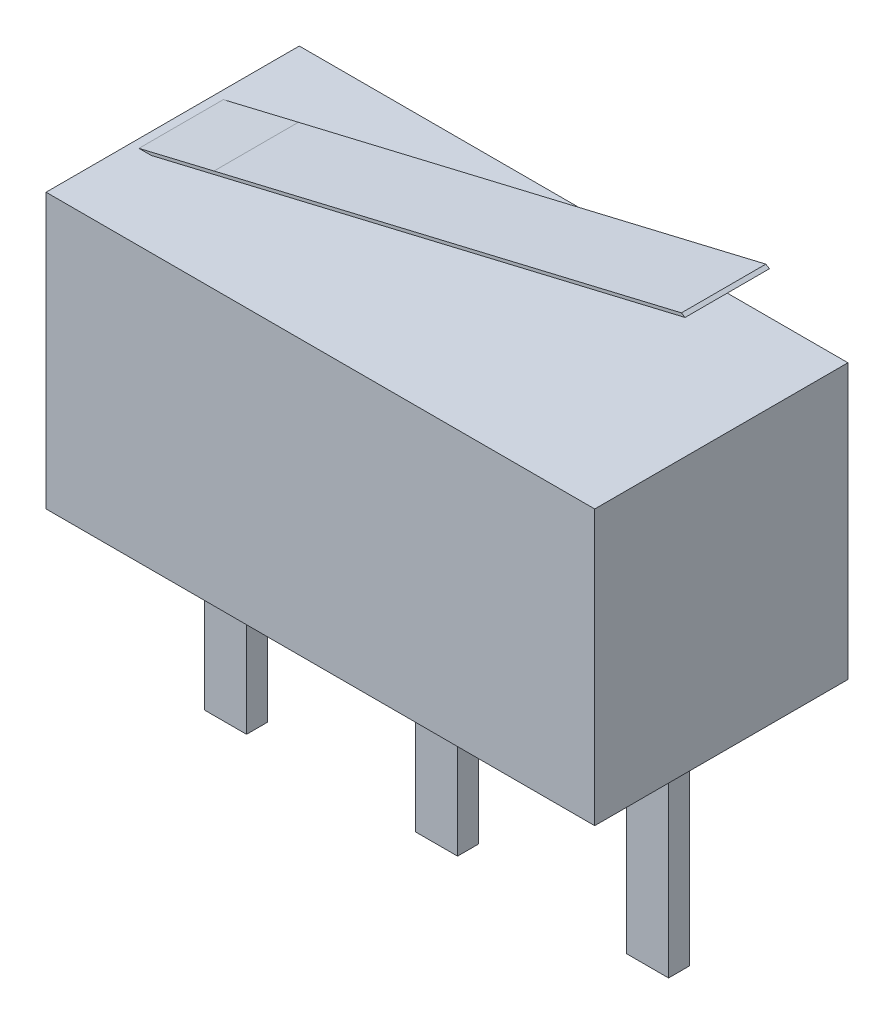
ISO-10303-21;
HEADER;
FILE_DESCRIPTION(('STEP AP214'),'2;1');
FILE_NAME('part.step','',(''),(''),'','','');
FILE_SCHEMA(('AUTOMOTIVE_DESIGN { 1 0 10303 214 1 1 1 1 }'));
ENDSEC;
DATA;
#1=APPLICATION_CONTEXT('core data for automotive mechanical design processes');
#2=APPLICATION_PROTOCOL_DEFINITION('international standard','automotive_design',2000,#1);
#3=PRODUCT_CONTEXT('',#1,'mechanical');
#4=PRODUCT('Part','Part','',(#3));
#5=PRODUCT_RELATED_PRODUCT_CATEGORY('part','',(#4));
#6=PRODUCT_DEFINITION_FORMATION('','',#4);
#7=PRODUCT_DEFINITION_CONTEXT('part definition',#1,'design');
#8=PRODUCT_DEFINITION('design','',#6,#7);
#9=PRODUCT_DEFINITION_SHAPE('','',#8);
#10=(LENGTH_UNIT() NAMED_UNIT(*) SI_UNIT(.MILLI.,.METRE.));
#11=(NAMED_UNIT(*) PLANE_ANGLE_UNIT() SI_UNIT($,.RADIAN.));
#12=(NAMED_UNIT(*) SI_UNIT($,.STERADIAN.) SOLID_ANGLE_UNIT());
#13=UNCERTAINTY_MEASURE_WITH_UNIT(LENGTH_MEASURE(1.E-05),#10,'distance_accuracy_value','');
#14=(GEOMETRIC_REPRESENTATION_CONTEXT(3) GLOBAL_UNCERTAINTY_ASSIGNED_CONTEXT((#13)) GLOBAL_UNIT_ASSIGNED_CONTEXT((#10,
#11,#12)) REPRESENTATION_CONTEXT('',''));
#15=CARTESIAN_POINT('',(0.,0.,0.));
#16=DIRECTION('',(0.,0.,1.));
#17=DIRECTION('',(1.,0.,0.));
#18=AXIS2_PLACEMENT_3D('',#15,#16,#17);
#19=CARTESIAN_POINT('',(0.,0.,0.));
#20=DIRECTION('',(0.,-1.,0.));
#21=DIRECTION('',(0.,0.,-1.));
#22=AXIS2_PLACEMENT_3D('',#19,#20,#21);
#23=PLANE('',#22);
#24=DIRECTION('',(0.,0.,-1.));
#25=VECTOR('',#24,1.);
#26=CARTESIAN_POINT('',(6.5,0.,3.));
#27=LINE('',#26,#25);
#28=CARTESIAN_POINT('',(6.5,0.,3.));
#29=VERTEX_POINT('',#28);
#30=CARTESIAN_POINT('',(6.5,0.,-3.));
#31=VERTEX_POINT('',#30);
#32=EDGE_CURVE('E308',#29,#31,#27,.T.);
#33=ORIENTED_EDGE('',*,*,#32,.F.);
#34=DIRECTION('',(1.,0.,0.));
#35=VECTOR('',#34,1.);
#36=CARTESIAN_POINT('',(-6.5,0.,3.));
#37=LINE('',#36,#35);
#38=CARTESIAN_POINT('',(-6.5,0.,3.));
#39=VERTEX_POINT('',#38);
#40=EDGE_CURVE('E313',#39,#29,#37,.T.);
#41=ORIENTED_EDGE('',*,*,#40,.F.);
#42=DIRECTION('',(0.,0.,1.));
#43=VECTOR('',#42,1.);
#44=CARTESIAN_POINT('',(-6.5,0.,3.));
#45=LINE('',#44,#43);
#46=CARTESIAN_POINT('',(-6.5,0.,-3.));
#47=VERTEX_POINT('',#46);
#48=EDGE_CURVE('E324',#47,#39,#45,.T.);
#49=ORIENTED_EDGE('',*,*,#48,.F.);
#50=DIRECTION('',(-1.,0.,0.));
#51=VECTOR('',#50,1.);
#52=CARTESIAN_POINT('',(-6.5,0.,-3.));
#53=LINE('',#52,#51);
#54=EDGE_CURVE('E322',#31,#47,#53,.T.);
#55=ORIENTED_EDGE('',*,*,#54,.F.);
#56=EDGE_LOOP('',(#33,#41,#49,#55));
#57=FACE_BOUND('',#56,.T.);
#58=DIRECTION('',(1.,0.,0.));
#59=VECTOR('',#58,1.);
#60=CARTESIAN_POINT('',(-4.5,0.,-0.25));
#61=LINE('',#60,#59);
#62=CARTESIAN_POINT('',(-5.5,0.,-0.25));
#63=VERTEX_POINT('',#62);
#64=CARTESIAN_POINT('',(-4.5,0.,-0.25));
#65=VERTEX_POINT('',#64);
#66=EDGE_CURVE('E293',#63,#65,#61,.T.);
#67=ORIENTED_EDGE('',*,*,#66,.F.);
#68=DIRECTION('',(0.,0.,-1.));
#69=VECTOR('',#68,1.);
#70=CARTESIAN_POINT('',(-5.5,0.,-0.25));
#71=LINE('',#70,#69);
#72=CARTESIAN_POINT('',(-5.5,0.,0.25));
#73=VERTEX_POINT('',#72);
#74=EDGE_CURVE('E272',#73,#63,#71,.T.);
#75=ORIENTED_EDGE('',*,*,#74,.F.);
#76=DIRECTION('',(-1.,0.,0.));
#77=VECTOR('',#76,1.);
#78=CARTESIAN_POINT('',(-4.5,0.,0.25));
#79=LINE('',#78,#77);
#80=CARTESIAN_POINT('',(-4.5,0.,0.25));
#81=VERTEX_POINT('',#80);
#82=EDGE_CURVE('E284',#81,#73,#79,.T.);
#83=ORIENTED_EDGE('',*,*,#82,.F.);
#84=DIRECTION('',(0.,0.,1.));
#85=VECTOR('',#84,1.);
#86=CARTESIAN_POINT('',(-4.5,0.,-0.25));
#87=LINE('',#86,#85);
#88=EDGE_CURVE('E295',#65,#81,#87,.T.);
#89=ORIENTED_EDGE('',*,*,#88,.F.);
#90=EDGE_LOOP('',(#67,#75,#83,#89));
#91=FACE_BOUND('',#90,.T.);
#92=DIRECTION('',(1.,0.,0.));
#93=VECTOR('',#92,1.);
#94=CARTESIAN_POINT('',(0.5,0.,-0.250000000000001));
#95=LINE('',#94,#93);
#96=CARTESIAN_POINT('',(-0.5,0.,-0.250000000000001));
#97=VERTEX_POINT('',#96);
#98=CARTESIAN_POINT('',(0.5,0.,-0.250000000000001));
#99=VERTEX_POINT('',#98);
#100=EDGE_CURVE('E267',#97,#99,#95,.T.);
#101=ORIENTED_EDGE('',*,*,#100,.F.);
#102=DIRECTION('',(0.,0.,-1.));
#103=VECTOR('',#102,1.);
#104=CARTESIAN_POINT('',(-0.5,0.,-0.250000000000001));
#105=LINE('',#104,#103);
#106=CARTESIAN_POINT('',(-0.5,0.,0.25));
#107=VERTEX_POINT('',#106);
#108=EDGE_CURVE('E269',#107,#97,#105,.T.);
#109=ORIENTED_EDGE('',*,*,#108,.F.);
#110=DIRECTION('',(-1.,0.,0.));
#111=VECTOR('',#110,1.);
#112=CARTESIAN_POINT('',(0.5,0.,0.25));
#113=LINE('',#112,#111);
#114=CARTESIAN_POINT('',(0.5,0.,0.25));
#115=VERTEX_POINT('',#114);
#116=EDGE_CURVE('E261',#115,#107,#113,.T.);
#117=ORIENTED_EDGE('',*,*,#116,.F.);
#118=DIRECTION('',(0.,0.,1.));
#119=VECTOR('',#118,1.);
#120=CARTESIAN_POINT('',(0.5,0.,-0.250000000000001));
#121=LINE('',#120,#119);
#122=EDGE_CURVE('E263',#99,#115,#121,.T.);
#123=ORIENTED_EDGE('',*,*,#122,.F.);
#124=EDGE_LOOP('',(#101,#109,#117,#123));
#125=FACE_BOUND('',#124,.T.);
#126=DIRECTION('',(1.,0.,0.));
#127=VECTOR('',#126,1.);
#128=CARTESIAN_POINT('',(5.5,0.,-0.25));
#129=LINE('',#128,#127);
#130=CARTESIAN_POINT('',(4.5,0.,-0.25));
#131=VERTEX_POINT('',#130);
#132=CARTESIAN_POINT('',(5.5,0.,-0.25));
#133=VERTEX_POINT('',#132);
#134=EDGE_CURVE('E238',#131,#133,#129,.T.);
#135=ORIENTED_EDGE('',*,*,#134,.F.);
#136=DIRECTION('',(0.,0.,-1.));
#137=VECTOR('',#136,1.);
#138=CARTESIAN_POINT('',(4.5,0.,-0.25));
#139=LINE('',#138,#137);
#140=CARTESIAN_POINT('',(4.5,0.,0.25));
#141=VERTEX_POINT('',#140);
#142=EDGE_CURVE('E240',#141,#131,#139,.T.);
#143=ORIENTED_EDGE('',*,*,#142,.F.);
#144=DIRECTION('',(-1.,0.,0.));
#145=VECTOR('',#144,1.);
#146=CARTESIAN_POINT('',(5.5,0.,0.25));
#147=LINE('',#146,#145);
#148=CARTESIAN_POINT('',(5.5,0.,0.25));
#149=VERTEX_POINT('',#148);
#150=EDGE_CURVE('E232',#149,#141,#147,.T.);
#151=ORIENTED_EDGE('',*,*,#150,.F.);
#152=DIRECTION('',(0.,0.,1.));
#153=VECTOR('',#152,1.);
#154=CARTESIAN_POINT('',(5.5,0.,-0.25));
#155=LINE('',#154,#153);
#156=EDGE_CURVE('E234',#133,#149,#155,.T.);
#157=ORIENTED_EDGE('',*,*,#156,.F.);
#158=EDGE_LOOP('',(#135,#143,#151,#157));
#159=FACE_BOUND('',#158,.T.);
#160=ADVANCED_FACE('F37',(#57,#91,#125,#159),#23,.T.);
#161=CARTESIAN_POINT('',(6.5,6.5,3.));
#162=DIRECTION('',(-1.,0.,0.));
#163=DIRECTION('',(0.,0.,1.));
#164=AXIS2_PLACEMENT_3D('',#161,#162,#163);
#165=PLANE('',#164);
#166=ORIENTED_EDGE('',*,*,#32,.T.);
#167=DIRECTION('',(0.,-1.,0.));
#168=VECTOR('',#167,1.);
#169=CARTESIAN_POINT('',(6.5,6.5,-3.));
#170=LINE('',#169,#168);
#171=CARTESIAN_POINT('',(6.5,6.5,-3.));
#172=VERTEX_POINT('',#171);
#173=EDGE_CURVE('E11',#172,#31,#170,.T.);
#174=ORIENTED_EDGE('',*,*,#173,.F.);
#175=DIRECTION('',(0.,0.,-1.));
#176=VECTOR('',#175,1.);
#177=CARTESIAN_POINT('',(6.5,6.5,3.));
#178=LINE('',#177,#176);
#179=CARTESIAN_POINT('',(6.5,6.5,3.));
#180=VERTEX_POINT('',#179);
#181=EDGE_CURVE('E309',#180,#172,#178,.T.);
#182=ORIENTED_EDGE('',*,*,#181,.F.);
#183=DIRECTION('',(0.,-1.,0.));
#184=VECTOR('',#183,1.);
#185=CARTESIAN_POINT('',(6.5,6.5,3.));
#186=LINE('',#185,#184);
#187=EDGE_CURVE('E319',#180,#29,#186,.T.);
#188=ORIENTED_EDGE('',*,*,#187,.T.);
#189=EDGE_LOOP('',(#166,#174,#182,#188));
#190=FACE_BOUND('',#189,.T.);
#191=ADVANCED_FACE('F39',(#190),#165,.F.);
#192=CARTESIAN_POINT('',(-6.5,6.5,-3.));
#193=DIRECTION('',(0.,0.,1.));
#194=DIRECTION('',(1.,0.,0.));
#195=AXIS2_PLACEMENT_3D('',#192,#193,#194);
#196=PLANE('',#195);
#197=ORIENTED_EDGE('',*,*,#54,.T.);
#198=DIRECTION('',(0.,-1.,0.));
#199=VECTOR('',#198,1.);
#200=CARTESIAN_POINT('',(-6.5,6.5,-3.));
#201=LINE('',#200,#199);
#202=CARTESIAN_POINT('',(-6.5,6.5,-3.));
#203=VERTEX_POINT('',#202);
#204=EDGE_CURVE('E45',#203,#47,#201,.T.);
#205=ORIENTED_EDGE('',*,*,#204,.F.);
#206=DIRECTION('',(-1.,0.,0.));
#207=VECTOR('',#206,1.);
#208=CARTESIAN_POINT('',(-6.5,6.5,-3.));
#209=LINE('',#208,#207);
#210=EDGE_CURVE('E312',#172,#203,#209,.T.);
#211=ORIENTED_EDGE('',*,*,#210,.F.);
#212=ORIENTED_EDGE('',*,*,#173,.T.);
#213=EDGE_LOOP('',(#197,#205,#211,#212));
#214=FACE_BOUND('',#213,.T.);
#215=ADVANCED_FACE('F352',(#214),#196,.F.);
#216=CARTESIAN_POINT('',(-6.5,6.5,3.));
#217=DIRECTION('',(1.,0.,0.));
#218=DIRECTION('',(0.,0.,-1.));
#219=AXIS2_PLACEMENT_3D('',#216,#217,#218);
#220=PLANE('',#219);
#221=ORIENTED_EDGE('',*,*,#48,.T.);
#222=DIRECTION('',(0.,-1.,0.));
#223=VECTOR('',#222,1.);
#224=CARTESIAN_POINT('',(-6.5,6.5,3.));
#225=LINE('',#224,#223);
#226=CARTESIAN_POINT('',(-6.5,6.5,3.));
#227=VERTEX_POINT('',#226);
#228=EDGE_CURVE('E329',#227,#39,#225,.T.);
#229=ORIENTED_EDGE('',*,*,#228,.F.);
#230=DIRECTION('',(0.,0.,1.));
#231=VECTOR('',#230,1.);
#232=CARTESIAN_POINT('',(-6.5,6.5,3.));
#233=LINE('',#232,#231);
#234=EDGE_CURVE('E315',#203,#227,#233,.T.);
#235=ORIENTED_EDGE('',*,*,#234,.F.);
#236=ORIENTED_EDGE('',*,*,#204,.T.);
#237=EDGE_LOOP('',(#221,#229,#235,#236));
#238=FACE_BOUND('',#237,.T.);
#239=ADVANCED_FACE('F336',(#238),#220,.F.);
#240=CARTESIAN_POINT('',(-6.5,6.5,3.));
#241=DIRECTION('',(0.,0.,-1.));
#242=DIRECTION('',(-1.,0.,0.));
#243=AXIS2_PLACEMENT_3D('',#240,#241,#242);
#244=PLANE('',#243);
#245=ORIENTED_EDGE('',*,*,#40,.T.);
#246=ORIENTED_EDGE('',*,*,#187,.F.);
#247=DIRECTION('',(1.,0.,0.));
#248=VECTOR('',#247,1.);
#249=CARTESIAN_POINT('',(-6.5,6.5,3.));
#250=LINE('',#249,#248);
#251=EDGE_CURVE('E317',#227,#180,#250,.T.);
#252=ORIENTED_EDGE('',*,*,#251,.F.);
#253=ORIENTED_EDGE('',*,*,#228,.T.);
#254=EDGE_LOOP('',(#245,#246,#252,#253));
#255=FACE_BOUND('',#254,.T.);
#256=ADVANCED_FACE('F345',(#255),#244,.F.);
#257=CARTESIAN_POINT('',(0.,6.5,0.));
#258=DIRECTION('',(0.,-1.,0.));
#259=DIRECTION('',(0.,0.,-1.));
#260=AXIS2_PLACEMENT_3D('',#257,#258,#259);
#261=PLANE('',#260);
#262=DIRECTION('',(0.,0.,-1.));
#263=VECTOR('',#262,1.);
#264=CARTESIAN_POINT('',(-6.00813504961085,6.5,1.));
#265=LINE('',#264,#263);
#266=CARTESIAN_POINT('',(-6.00813504961085,6.5,1.));
#267=VERTEX_POINT('',#266);
#268=CARTESIAN_POINT('',(-6.00813504961085,6.5,-1.));
#269=VERTEX_POINT('',#268);
#270=EDGE_CURVE('E52',#267,#269,#265,.T.);
#271=ORIENTED_EDGE('',*,*,#270,.F.);
#272=DIRECTION('',(1.,0.,0.));
#273=VECTOR('',#272,1.);
#274=CARTESIAN_POINT('',(-6.3,6.5,1.));
#275=LINE('',#274,#273);
#276=CARTESIAN_POINT('',(-6.3,6.5,1.));
#277=VERTEX_POINT('',#276);
#278=EDGE_CURVE('E57',#277,#267,#275,.T.);
#279=ORIENTED_EDGE('',*,*,#278,.F.);
#280=DIRECTION('',(0.,0.,-1.));
#281=VECTOR('',#280,1.);
#282=CARTESIAN_POINT('',(-6.3,6.5,1.));
#283=LINE('',#282,#281);
#284=CARTESIAN_POINT('',(-6.3,6.5,-1.));
#285=VERTEX_POINT('',#284);
#286=EDGE_CURVE('E204',#277,#285,#283,.T.);
#287=ORIENTED_EDGE('',*,*,#286,.T.);
#288=DIRECTION('',(1.,0.,0.));
#289=VECTOR('',#288,1.);
#290=CARTESIAN_POINT('',(-6.3,6.5,-1.));
#291=LINE('',#290,#289);
#292=EDGE_CURVE('E205',#285,#269,#291,.T.);
#293=ORIENTED_EDGE('',*,*,#292,.T.);
#294=EDGE_LOOP('',(#271,#279,#287,#293));
#295=FACE_BOUND('',#294,.T.);
#296=ORIENTED_EDGE('',*,*,#181,.T.);
#297=ORIENTED_EDGE('',*,*,#210,.T.);
#298=ORIENTED_EDGE('',*,*,#234,.T.);
#299=ORIENTED_EDGE('',*,*,#251,.T.);
#300=EDGE_LOOP('',(#296,#297,#298,#299));
#301=FACE_BOUND('',#300,.T.);
#302=ADVANCED_FACE('F351',(#295,#301),#261,.F.);
#303=CARTESIAN_POINT('',(-5.5,-5.,-0.25));
#304=DIRECTION('',(1.,0.,0.));
#305=DIRECTION('',(0.,0.,-1.));
#306=AXIS2_PLACEMENT_3D('',#303,#304,#305);
#307=PLANE('',#306);
#308=ORIENTED_EDGE('',*,*,#74,.T.);
#309=DIRECTION('',(0.,1.,0.));
#310=VECTOR('',#309,1.);
#311=CARTESIAN_POINT('',(-5.5,-5.,-0.25));
#312=LINE('',#311,#310);
#313=CARTESIAN_POINT('',(-5.5,-5.,-0.25));
#314=VERTEX_POINT('',#313);
#315=EDGE_CURVE('E306',#314,#63,#312,.T.);
#316=ORIENTED_EDGE('',*,*,#315,.F.);
#317=DIRECTION('',(0.,0.,-1.));
#318=VECTOR('',#317,1.);
#319=CARTESIAN_POINT('',(-5.5,-5.,-0.25));
#320=LINE('',#319,#318);
#321=CARTESIAN_POINT('',(-5.5,-5.,0.25));
#322=VERTEX_POINT('',#321);
#323=EDGE_CURVE('E280',#322,#314,#320,.T.);
#324=ORIENTED_EDGE('',*,*,#323,.F.);
#325=DIRECTION('',(0.,1.,0.));
#326=VECTOR('',#325,1.);
#327=CARTESIAN_POINT('',(-5.5,-5.,0.25));
#328=LINE('',#327,#326);
#329=EDGE_CURVE('E290',#322,#73,#328,.T.);
#330=ORIENTED_EDGE('',*,*,#329,.T.);
#331=EDGE_LOOP('',(#308,#316,#324,#330));
#332=FACE_BOUND('',#331,.T.);
#333=ADVANCED_FACE('F370',(#332),#307,.F.);
#334=CARTESIAN_POINT('',(-4.5,-5.,-0.25));
#335=DIRECTION('',(0.,0.,1.));
#336=DIRECTION('',(1.,0.,0.));
#337=AXIS2_PLACEMENT_3D('',#334,#335,#336);
#338=PLANE('',#337);
#339=ORIENTED_EDGE('',*,*,#66,.T.);
#340=DIRECTION('',(0.,1.,0.));
#341=VECTOR('',#340,1.);
#342=CARTESIAN_POINT('',(-4.5,-5.,-0.25));
#343=LINE('',#342,#341);
#344=CARTESIAN_POINT('',(-4.5,-5.,-0.25));
#345=VERTEX_POINT('',#344);
#346=EDGE_CURVE('E303',#345,#65,#343,.T.);
#347=ORIENTED_EDGE('',*,*,#346,.F.);
#348=DIRECTION('',(1.,0.,0.));
#349=VECTOR('',#348,1.);
#350=CARTESIAN_POINT('',(-4.5,-5.,-0.25));
#351=LINE('',#350,#349);
#352=EDGE_CURVE('E283',#314,#345,#351,.T.);
#353=ORIENTED_EDGE('',*,*,#352,.F.);
#354=ORIENTED_EDGE('',*,*,#315,.T.);
#355=EDGE_LOOP('',(#339,#347,#353,#354));
#356=FACE_BOUND('',#355,.T.);
#357=ADVANCED_FACE('F374',(#356),#338,.F.);
#358=CARTESIAN_POINT('',(-4.5,-5.,-0.25));
#359=DIRECTION('',(-1.,0.,0.));
#360=DIRECTION('',(0.,0.,1.));
#361=AXIS2_PLACEMENT_3D('',#358,#359,#360);
#362=PLANE('',#361);
#363=ORIENTED_EDGE('',*,*,#88,.T.);
#364=DIRECTION('',(0.,1.,0.));
#365=VECTOR('',#364,1.);
#366=CARTESIAN_POINT('',(-4.5,-5.,0.25));
#367=LINE('',#366,#365);
#368=CARTESIAN_POINT('',(-4.5,-5.,0.25));
#369=VERTEX_POINT('',#368);
#370=EDGE_CURVE('E301',#369,#81,#367,.T.);
#371=ORIENTED_EDGE('',*,*,#370,.F.);
#372=DIRECTION('',(0.,0.,1.));
#373=VECTOR('',#372,1.);
#374=CARTESIAN_POINT('',(-4.5,-5.,-0.25));
#375=LINE('',#374,#373);
#376=EDGE_CURVE('E286',#345,#369,#375,.T.);
#377=ORIENTED_EDGE('',*,*,#376,.F.);
#378=ORIENTED_EDGE('',*,*,#346,.T.);
#379=EDGE_LOOP('',(#363,#371,#377,#378));
#380=FACE_BOUND('',#379,.T.);
#381=ADVANCED_FACE('F379',(#380),#362,.F.);
#382=CARTESIAN_POINT('',(-4.5,-5.,0.25));
#383=DIRECTION('',(0.,0.,-1.));
#384=DIRECTION('',(-1.,0.,0.));
#385=AXIS2_PLACEMENT_3D('',#382,#383,#384);
#386=PLANE('',#385);
#387=ORIENTED_EDGE('',*,*,#82,.T.);
#388=ORIENTED_EDGE('',*,*,#329,.F.);
#389=DIRECTION('',(-1.,0.,0.));
#390=VECTOR('',#389,1.);
#391=CARTESIAN_POINT('',(-4.5,-5.,0.25));
#392=LINE('',#391,#390);
#393=EDGE_CURVE('E288',#369,#322,#392,.T.);
#394=ORIENTED_EDGE('',*,*,#393,.F.);
#395=ORIENTED_EDGE('',*,*,#370,.T.);
#396=EDGE_LOOP('',(#387,#388,#394,#395));
#397=FACE_BOUND('',#396,.T.);
#398=ADVANCED_FACE('F385',(#397),#386,.F.);
#399=CARTESIAN_POINT('',(0.,-5.,0.));
#400=DIRECTION('',(0.,-1.,0.));
#401=DIRECTION('',(0.,0.,-1.));
#402=AXIS2_PLACEMENT_3D('',#399,#400,#401);
#403=PLANE('',#402);
#404=ORIENTED_EDGE('',*,*,#323,.T.);
#405=ORIENTED_EDGE('',*,*,#352,.T.);
#406=ORIENTED_EDGE('',*,*,#376,.T.);
#407=ORIENTED_EDGE('',*,*,#393,.T.);
#408=EDGE_LOOP('',(#404,#405,#406,#407));
#409=FACE_BOUND('',#408,.T.);
#410=ADVANCED_FACE('F389',(#409),#403,.T.);
#411=CARTESIAN_POINT('',(-0.5,-5.,-0.250000000000001));
#412=DIRECTION('',(1.,0.,0.));
#413=DIRECTION('',(0.,0.,-1.));
#414=AXIS2_PLACEMENT_3D('',#411,#412,#413);
#415=PLANE('',#414);
#416=ORIENTED_EDGE('',*,*,#108,.T.);
#417=DIRECTION('',(0.,1.,0.));
#418=VECTOR('',#417,1.);
#419=CARTESIAN_POINT('',(-0.5,-5.,-0.250000000000001));
#420=LINE('',#419,#418);
#421=CARTESIAN_POINT('',(-0.5,-5.,-0.250000000000001));
#422=VERTEX_POINT('',#421);
#423=EDGE_CURVE('E243',#422,#97,#420,.T.);
#424=ORIENTED_EDGE('',*,*,#423,.F.);
#425=DIRECTION('',(0.,0.,-1.));
#426=VECTOR('',#425,1.);
#427=CARTESIAN_POINT('',(-0.5,-5.,-0.250000000000001));
#428=LINE('',#427,#426);
#429=CARTESIAN_POINT('',(-0.5,-5.,0.25));
#430=VERTEX_POINT('',#429);
#431=EDGE_CURVE('E264',#430,#422,#428,.T.);
#432=ORIENTED_EDGE('',*,*,#431,.F.);
#433=DIRECTION('',(0.,1.,0.));
#434=VECTOR('',#433,1.);
#435=CARTESIAN_POINT('',(-0.5,-5.,0.25));
#436=LINE('',#435,#434);
#437=EDGE_CURVE('E257',#430,#107,#436,.T.);
#438=ORIENTED_EDGE('',*,*,#437,.T.);
#439=EDGE_LOOP('',(#416,#424,#432,#438));
#440=FACE_BOUND('',#439,.T.);
#441=ADVANCED_FACE('F393',(#440),#415,.F.);
#442=CARTESIAN_POINT('',(0.5,-5.,-0.250000000000001));
#443=DIRECTION('',(0.,0.,1.));
#444=DIRECTION('',(1.,0.,0.));
#445=AXIS2_PLACEMENT_3D('',#442,#443,#444);
#446=PLANE('',#445);
#447=ORIENTED_EDGE('',*,*,#100,.T.);
#448=DIRECTION('',(0.,1.,0.));
#449=VECTOR('',#448,1.);
#450=CARTESIAN_POINT('',(0.5,-5.,-0.250000000000001));
#451=LINE('',#450,#449);
#452=CARTESIAN_POINT('',(0.5,-5.,-0.250000000000001));
#453=VERTEX_POINT('',#452);
#454=EDGE_CURVE('E252',#453,#99,#451,.T.);
#455=ORIENTED_EDGE('',*,*,#454,.F.);
#456=DIRECTION('',(1.,0.,0.));
#457=VECTOR('',#456,1.);
#458=CARTESIAN_POINT('',(0.5,-5.,-0.250000000000001));
#459=LINE('',#458,#457);
#460=EDGE_CURVE('E276',#422,#453,#459,.T.);
#461=ORIENTED_EDGE('',*,*,#460,.F.);
#462=ORIENTED_EDGE('',*,*,#423,.T.);
#463=EDGE_LOOP('',(#447,#455,#461,#462));
#464=FACE_BOUND('',#463,.T.);
#465=ADVANCED_FACE('F407',(#464),#446,.F.);
#466=CARTESIAN_POINT('',(0.5,-5.,-0.250000000000001));
#467=DIRECTION('',(-1.,0.,0.));
#468=DIRECTION('',(0.,0.,1.));
#469=AXIS2_PLACEMENT_3D('',#466,#467,#468);
#470=PLANE('',#469);
#471=ORIENTED_EDGE('',*,*,#122,.T.);
#472=DIRECTION('',(0.,1.,0.));
#473=VECTOR('',#472,1.);
#474=CARTESIAN_POINT('',(0.5,-5.,0.25));
#475=LINE('',#474,#473);
#476=CARTESIAN_POINT('',(0.5,-5.,0.25));
#477=VERTEX_POINT('',#476);
#478=EDGE_CURVE('E255',#477,#115,#475,.T.);
#479=ORIENTED_EDGE('',*,*,#478,.F.);
#480=DIRECTION('',(0.,0.,1.));
#481=VECTOR('',#480,1.);
#482=CARTESIAN_POINT('',(0.5,-5.,-0.250000000000001));
#483=LINE('',#482,#481);
#484=EDGE_CURVE('E274',#453,#477,#483,.T.);
#485=ORIENTED_EDGE('',*,*,#484,.F.);
#486=ORIENTED_EDGE('',*,*,#454,.T.);
#487=EDGE_LOOP('',(#471,#479,#485,#486));
#488=FACE_BOUND('',#487,.T.);
#489=ADVANCED_FACE('F403',(#488),#470,.F.);
#490=CARTESIAN_POINT('',(0.5,-5.,0.25));
#491=DIRECTION('',(0.,0.,-1.));
#492=DIRECTION('',(-1.,0.,0.));
#493=AXIS2_PLACEMENT_3D('',#490,#491,#492);
#494=PLANE('',#493);
#495=ORIENTED_EDGE('',*,*,#116,.T.);
#496=ORIENTED_EDGE('',*,*,#437,.F.);
#497=DIRECTION('',(-1.,0.,0.));
#498=VECTOR('',#497,1.);
#499=CARTESIAN_POINT('',(0.5,-5.,0.25));
#500=LINE('',#499,#498);
#501=EDGE_CURVE('E260',#477,#430,#500,.T.);
#502=ORIENTED_EDGE('',*,*,#501,.F.);
#503=ORIENTED_EDGE('',*,*,#478,.T.);
#504=EDGE_LOOP('',(#495,#496,#502,#503));
#505=FACE_BOUND('',#504,.T.);
#506=ADVANCED_FACE('F399',(#505),#494,.F.);
#507=CARTESIAN_POINT('',(0.,-5.,0.));
#508=DIRECTION('',(0.,-1.,0.));
#509=DIRECTION('',(0.,0.,-1.));
#510=AXIS2_PLACEMENT_3D('',#507,#508,#509);
#511=PLANE('',#510);
#512=ORIENTED_EDGE('',*,*,#431,.T.);
#513=ORIENTED_EDGE('',*,*,#460,.T.);
#514=ORIENTED_EDGE('',*,*,#484,.T.);
#515=ORIENTED_EDGE('',*,*,#501,.T.);
#516=EDGE_LOOP('',(#512,#513,#514,#515));
#517=FACE_BOUND('',#516,.T.);
#518=ADVANCED_FACE('F395',(#517),#511,.T.);
#519=CARTESIAN_POINT('',(4.5,-5.,-0.25));
#520=DIRECTION('',(1.,0.,0.));
#521=DIRECTION('',(0.,0.,-1.));
#522=AXIS2_PLACEMENT_3D('',#519,#520,#521);
#523=PLANE('',#522);
#524=ORIENTED_EDGE('',*,*,#142,.T.);
#525=DIRECTION('',(0.,1.,0.));
#526=VECTOR('',#525,1.);
#527=CARTESIAN_POINT('',(4.5,-5.,-0.25));
#528=LINE('',#527,#526);
#529=CARTESIAN_POINT('',(4.5,-5.,-0.25));
#530=VERTEX_POINT('',#529);
#531=EDGE_CURVE('E221',#530,#131,#528,.T.);
#532=ORIENTED_EDGE('',*,*,#531,.F.);
#533=DIRECTION('',(0.,0.,-1.));
#534=VECTOR('',#533,1.);
#535=CARTESIAN_POINT('',(4.5,-5.,-0.25));
#536=LINE('',#535,#534);
#537=CARTESIAN_POINT('',(4.5,-5.,0.25));
#538=VERTEX_POINT('',#537);
#539=EDGE_CURVE('E235',#538,#530,#536,.T.);
#540=ORIENTED_EDGE('',*,*,#539,.F.);
#541=DIRECTION('',(0.,1.,0.));
#542=VECTOR('',#541,1.);
#543=CARTESIAN_POINT('',(4.5,-5.,0.25));
#544=LINE('',#543,#542);
#545=EDGE_CURVE('E228',#538,#141,#544,.T.);
#546=ORIENTED_EDGE('',*,*,#545,.T.);
#547=EDGE_LOOP('',(#524,#532,#540,#546));
#548=FACE_BOUND('',#547,.T.);
#549=ADVANCED_FACE('F398',(#548),#523,.F.);
#550=CARTESIAN_POINT('',(5.5,-5.,-0.25));
#551=DIRECTION('',(0.,0.,1.));
#552=DIRECTION('',(1.,0.,0.));
#553=AXIS2_PLACEMENT_3D('',#550,#551,#552);
#554=PLANE('',#553);
#555=ORIENTED_EDGE('',*,*,#134,.T.);
#556=DIRECTION('',(0.,1.,0.));
#557=VECTOR('',#556,1.);
#558=CARTESIAN_POINT('',(5.5,-5.,-0.25));
#559=LINE('',#558,#557);
#560=CARTESIAN_POINT('',(5.5,-5.,-0.25));
#561=VERTEX_POINT('',#560);
#562=EDGE_CURVE('E223',#561,#133,#559,.T.);
#563=ORIENTED_EDGE('',*,*,#562,.F.);
#564=DIRECTION('',(1.,0.,0.));
#565=VECTOR('',#564,1.);
#566=CARTESIAN_POINT('',(5.5,-5.,-0.25));
#567=LINE('',#566,#565);
#568=EDGE_CURVE('E247',#530,#561,#567,.T.);
#569=ORIENTED_EDGE('',*,*,#568,.F.);
#570=ORIENTED_EDGE('',*,*,#531,.T.);
#571=EDGE_LOOP('',(#555,#563,#569,#570));
#572=FACE_BOUND('',#571,.T.);
#573=ADVANCED_FACE('F426',(#572),#554,.F.);
#574=CARTESIAN_POINT('',(5.5,-5.,-0.25));
#575=DIRECTION('',(-1.,0.,0.));
#576=DIRECTION('',(0.,0.,1.));
#577=AXIS2_PLACEMENT_3D('',#574,#575,#576);
#578=PLANE('',#577);
#579=ORIENTED_EDGE('',*,*,#156,.T.);
#580=DIRECTION('',(0.,1.,0.));
#581=VECTOR('',#580,1.);
#582=CARTESIAN_POINT('',(5.5,-5.,0.25));
#583=LINE('',#582,#581);
#584=CARTESIAN_POINT('',(5.5,-5.,0.25));
#585=VERTEX_POINT('',#584);
#586=EDGE_CURVE('E226',#585,#149,#583,.T.);
#587=ORIENTED_EDGE('',*,*,#586,.F.);
#588=DIRECTION('',(0.,0.,1.));
#589=VECTOR('',#588,1.);
#590=CARTESIAN_POINT('',(5.5,-5.,-0.25));
#591=LINE('',#590,#589);
#592=EDGE_CURVE('E245',#561,#585,#591,.T.);
#593=ORIENTED_EDGE('',*,*,#592,.F.);
#594=ORIENTED_EDGE('',*,*,#562,.T.);
#595=EDGE_LOOP('',(#579,#587,#593,#594));
#596=FACE_BOUND('',#595,.T.);
#597=ADVANCED_FACE('F422',(#596),#578,.F.);
#598=CARTESIAN_POINT('',(5.5,-5.,0.25));
#599=DIRECTION('',(0.,0.,-1.));
#600=DIRECTION('',(-1.,0.,0.));
#601=AXIS2_PLACEMENT_3D('',#598,#599,#600);
#602=PLANE('',#601);
#603=ORIENTED_EDGE('',*,*,#150,.T.);
#604=ORIENTED_EDGE('',*,*,#545,.F.);
#605=DIRECTION('',(-1.,0.,0.));
#606=VECTOR('',#605,1.);
#607=CARTESIAN_POINT('',(5.5,-5.,0.25));
#608=LINE('',#607,#606);
#609=EDGE_CURVE('E231',#585,#538,#608,.T.);
#610=ORIENTED_EDGE('',*,*,#609,.F.);
#611=ORIENTED_EDGE('',*,*,#586,.T.);
#612=EDGE_LOOP('',(#603,#604,#610,#611));
#613=FACE_BOUND('',#612,.T.);
#614=ADVANCED_FACE('F418',(#613),#602,.F.);
#615=CARTESIAN_POINT('',(0.,-5.,0.));
#616=DIRECTION('',(0.,-1.,0.));
#617=DIRECTION('',(0.,0.,-1.));
#618=AXIS2_PLACEMENT_3D('',#615,#616,#617);
#619=PLANE('',#618);
#620=ORIENTED_EDGE('',*,*,#539,.T.);
#621=ORIENTED_EDGE('',*,*,#568,.T.);
#622=ORIENTED_EDGE('',*,*,#592,.T.);
#623=ORIENTED_EDGE('',*,*,#609,.T.);
#624=EDGE_LOOP('',(#620,#621,#622,#623));
#625=FACE_BOUND('',#624,.T.);
#626=ADVANCED_FACE('F415',(#625),#619,.T.);
#627=CARTESIAN_POINT('',(-6.00813504961085,6.5,1.));
#628=DIRECTION('',(-0.230769230769231,0.97300851082104,0.));
#629=DIRECTION('',(-0.97300851082104,-0.230769230769231,0.));
#630=AXIS2_PLACEMENT_3D('',#627,#628,#629);
#631=PLANE('',#630);
#632=DIRECTION('',(0.97300851082104,0.230769230769231,0.));
#633=VECTOR('',#632,1.);
#634=CARTESIAN_POINT('',(-6.00813504961085,6.5,-1.));
#635=LINE('',#634,#633);
#636=CARTESIAN_POINT('',(6.64097559106267,9.5,-1.));
#637=VERTEX_POINT('',#636);
#638=EDGE_CURVE('E189',#269,#637,#635,.T.);
#639=ORIENTED_EDGE('',*,*,#638,.T.);
#640=DIRECTION('',(0.,0.,-1.));
#641=VECTOR('',#640,1.);
#642=CARTESIAN_POINT('',(6.64097559106267,9.5,1.));
#643=LINE('',#642,#641);
#644=CARTESIAN_POINT('',(6.64097559106267,9.5,1.));
#645=VERTEX_POINT('',#644);
#646=EDGE_CURVE('E186',#645,#637,#643,.T.);
#647=ORIENTED_EDGE('',*,*,#646,.F.);
#648=DIRECTION('',(0.97300851082104,0.230769230769231,0.));
#649=VECTOR('',#648,1.);
#650=CARTESIAN_POINT('',(-6.00813504961085,6.5,1.));
#651=LINE('',#650,#649);
#652=EDGE_CURVE('E177',#267,#645,#651,.T.);
#653=ORIENTED_EDGE('',*,*,#652,.F.);
#654=ORIENTED_EDGE('',*,*,#270,.T.);
#655=EDGE_LOOP('',(#639,#647,#653,#654));
#656=FACE_BOUND('',#655,.T.);
#657=ADVANCED_FACE('F187',(#656),#631,.F.);
#658=CARTESIAN_POINT('',(6.64097559106267,9.5,1.));
#659=DIRECTION('',(-0.517843454081681,-0.85547539828142,0.));
#660=DIRECTION('',(0.85547539828142,-0.517843454081681,0.));
#661=AXIS2_PLACEMENT_3D('',#658,#659,#660);
#662=PLANE('',#661);
#663=DIRECTION('',(-0.85547539828142,0.517843454081681,0.));
#664=VECTOR('',#663,1.);
#665=CARTESIAN_POINT('',(6.64097559106267,9.5,-1.));
#666=LINE('',#665,#664);
#667=CARTESIAN_POINT('',(6.55542805123453,9.55178434540817,-1.));
#668=VERTEX_POINT('',#667);
#669=EDGE_CURVE('E208',#637,#668,#666,.T.);
#670=ORIENTED_EDGE('',*,*,#669,.T.);
#671=DIRECTION('',(0.,0.,-1.));
#672=VECTOR('',#671,1.);
#673=CARTESIAN_POINT('',(6.55542805123453,9.55178434540817,1.));
#674=LINE('',#673,#672);
#675=CARTESIAN_POINT('',(6.55542805123453,9.55178434540817,1.));
#676=VERTEX_POINT('',#675);
#677=EDGE_CURVE('E192',#676,#668,#674,.T.);
#678=ORIENTED_EDGE('',*,*,#677,.F.);
#679=DIRECTION('',(-0.85547539828142,0.517843454081681,0.));
#680=VECTOR('',#679,1.);
#681=CARTESIAN_POINT('',(6.64097559106267,9.5,1.));
#682=LINE('',#681,#680);
#683=EDGE_CURVE('E181',#645,#676,#682,.T.);
#684=ORIENTED_EDGE('',*,*,#683,.F.);
#685=ORIENTED_EDGE('',*,*,#646,.T.);
#686=EDGE_LOOP('',(#670,#678,#684,#685));
#687=FACE_BOUND('',#686,.T.);
#688=ADVANCED_FACE('F194',(#687),#662,.F.);
#689=CARTESIAN_POINT('',(6.55542805123453,9.55178434540817,1.));
#690=DIRECTION('',(0.230769230769231,-0.97300851082104,0.));
#691=DIRECTION('',(0.97300851082104,0.230769230769231,0.));
#692=AXIS2_PLACEMENT_3D('',#689,#690,#691);
#693=PLANE('',#692);
#694=DIRECTION('',(-0.97300851082104,-0.230769230769231,0.));
#695=VECTOR('',#694,1.);
#696=CARTESIAN_POINT('',(6.55542805123453,9.55178434540817,-1.));
#697=LINE('',#696,#695);
#698=CARTESIAN_POINT('',(-4.52069581524053,6.92485091559228,-1.));
#699=VERTEX_POINT('',#698);
#700=EDGE_CURVE('E210',#668,#699,#697,.T.);
#701=ORIENTED_EDGE('',*,*,#700,.T.);
#702=DIRECTION('',(0.,0.,-1.));
#703=VECTOR('',#702,1.);
#704=CARTESIAN_POINT('',(-4.52069581524053,6.92485091559228,1.));
#705=LINE('',#704,#703);
#706=CARTESIAN_POINT('',(-4.52069581524053,6.92485091559228,1.));
#707=VERTEX_POINT('',#706);
#708=EDGE_CURVE('E216',#707,#699,#705,.T.);
#709=ORIENTED_EDGE('',*,*,#708,.F.);
#710=DIRECTION('',(-0.97300851082104,-0.230769230769231,0.));
#711=VECTOR('',#710,1.);
#712=CARTESIAN_POINT('',(6.55542805123453,9.55178434540817,1.));
#713=LINE('',#712,#711);
#714=EDGE_CURVE('E197',#676,#707,#713,.T.);
#715=ORIENTED_EDGE('',*,*,#714,.F.);
#716=ORIENTED_EDGE('',*,*,#677,.T.);
#717=EDGE_LOOP('',(#701,#709,#715,#716));
#718=FACE_BOUND('',#717,.T.);
#719=ADVANCED_FACE('F438',(#718),#693,.F.);
#720=CARTESIAN_POINT('',(-4.52069581524053,6.92485091559228,1.));
#721=DIRECTION('',(0.232244921358469,-0.972657337659671,0.));
#722=DIRECTION('',(0.972657337659671,0.232244921358469,0.));
#723=AXIS2_PLACEMENT_3D('',#720,#721,#722);
#724=PLANE('',#723);
#725=DIRECTION('',(-0.972657337659671,-0.232244921358469,0.));
#726=VECTOR('',#725,1.);
#727=CARTESIAN_POINT('',(-4.52069581524053,6.92485091559228,-1.));
#728=LINE('',#727,#726);
#729=EDGE_CURVE('E212',#699,#285,#728,.T.);
#730=ORIENTED_EDGE('',*,*,#729,.T.);
#731=ORIENTED_EDGE('',*,*,#286,.F.);
#732=DIRECTION('',(-0.972657337659671,-0.232244921358469,0.));
#733=VECTOR('',#732,1.);
#734=CARTESIAN_POINT('',(-4.52069581524053,6.92485091559228,1.));
#735=LINE('',#734,#733);
#736=EDGE_CURVE('E199',#707,#277,#735,.T.);
#737=ORIENTED_EDGE('',*,*,#736,.F.);
#738=ORIENTED_EDGE('',*,*,#708,.T.);
#739=EDGE_LOOP('',(#730,#731,#737,#738));
#740=FACE_BOUND('',#739,.T.);
#741=ADVANCED_FACE('F441',(#740),#724,.F.);
#742=CARTESIAN_POINT('',(0.,0.,1.));
#743=DIRECTION('',(0.,0.,1.));
#744=DIRECTION('',(1.,0.,0.));
#745=AXIS2_PLACEMENT_3D('',#742,#743,#744);
#746=PLANE('',#745);
#747=ORIENTED_EDGE('',*,*,#278,.T.);
#748=ORIENTED_EDGE('',*,*,#652,.T.);
#749=ORIENTED_EDGE('',*,*,#683,.T.);
#750=ORIENTED_EDGE('',*,*,#714,.T.);
#751=ORIENTED_EDGE('',*,*,#736,.T.);
#752=EDGE_LOOP('',(#747,#748,#749,#750,#751));
#753=FACE_BOUND('',#752,.T.);
#754=ADVANCED_FACE('F179',(#753),#746,.T.);
#755=CARTESIAN_POINT('',(0.,0.,-1.));
#756=DIRECTION('',(0.,0.,1.));
#757=DIRECTION('',(1.,0.,0.));
#758=AXIS2_PLACEMENT_3D('',#755,#756,#757);
#759=PLANE('',#758);
#760=ORIENTED_EDGE('',*,*,#292,.F.);
#761=ORIENTED_EDGE('',*,*,#729,.F.);
#762=ORIENTED_EDGE('',*,*,#700,.F.);
#763=ORIENTED_EDGE('',*,*,#669,.F.);
#764=ORIENTED_EDGE('',*,*,#638,.F.);
#765=EDGE_LOOP('',(#760,#761,#762,#763,#764));
#766=FACE_BOUND('',#765,.T.);
#767=ADVANCED_FACE('F446',(#766),#759,.F.);
#768=CLOSED_SHELL('',(#160,#191,#215,#239,#256,#302,#333,#357,#381,#398,#410,#441,#465,#489,
#506,#518,#549,#573,#597,#614,#626,#657,#688,#719,#741,#754,#767));
#769=MANIFOLD_SOLID_BREP('B2',#768);
#770=ADVANCED_BREP_SHAPE_REPRESENTATION('',(#18,#769),#14);
#771=SHAPE_DEFINITION_REPRESENTATION(#9,#770);
ENDSEC;
END-ISO-10303-21;
